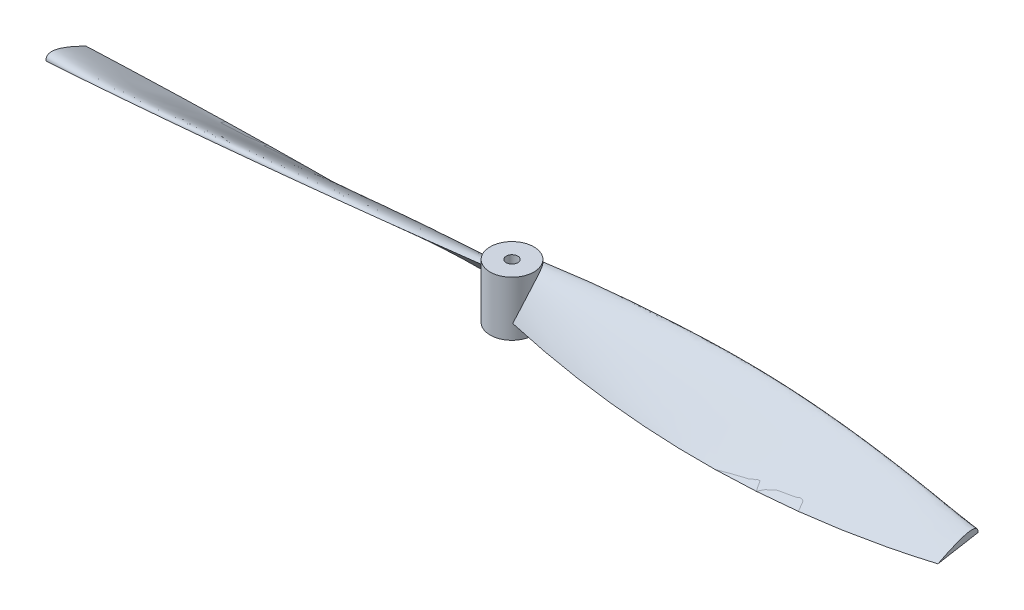
ISO-10303-21;
HEADER;
FILE_DESCRIPTION(('STEP AP214'),'2;1');
FILE_NAME('part.step','',(''),(''),'','','');
FILE_SCHEMA(('AUTOMOTIVE_DESIGN { 1 0 10303 214 1 1 1 1 }'));
ENDSEC;
DATA;
#1=APPLICATION_CONTEXT('core data for automotive mechanical design processes');
#2=APPLICATION_PROTOCOL_DEFINITION('international standard','automotive_design',2000,#1);
#3=PRODUCT_CONTEXT('',#1,'mechanical');
#4=PRODUCT('Part','Part','',(#3));
#5=PRODUCT_RELATED_PRODUCT_CATEGORY('part','',(#4));
#6=PRODUCT_DEFINITION_FORMATION('','',#4);
#7=PRODUCT_DEFINITION_CONTEXT('part definition',#1,'design');
#8=PRODUCT_DEFINITION('design','',#6,#7);
#9=PRODUCT_DEFINITION_SHAPE('','',#8);
#10=(LENGTH_UNIT() NAMED_UNIT(*) SI_UNIT(.MILLI.,.METRE.));
#11=(NAMED_UNIT(*) PLANE_ANGLE_UNIT() SI_UNIT($,.RADIAN.));
#12=(NAMED_UNIT(*) SI_UNIT($,.STERADIAN.) SOLID_ANGLE_UNIT());
#13=UNCERTAINTY_MEASURE_WITH_UNIT(LENGTH_MEASURE(1.E-05),#10,'distance_accuracy_value','');
#14=(GEOMETRIC_REPRESENTATION_CONTEXT(3) GLOBAL_UNCERTAINTY_ASSIGNED_CONTEXT((#13)) GLOBAL_UNIT_ASSIGNED_CONTEXT((#10,
#11,#12)) REPRESENTATION_CONTEXT('',''));
#15=CARTESIAN_POINT('',(0.,0.,0.));
#16=DIRECTION('',(0.,0.,1.));
#17=DIRECTION('',(1.,0.,0.));
#18=AXIS2_PLACEMENT_3D('',#15,#16,#17);
#19=CARTESIAN_POINT('',(0.,15.,0.));
#20=DIRECTION('',(0.,-1.,0.));
#21=DIRECTION('',(0.,0.,-1.));
#22=AXIS2_PLACEMENT_3D('',#19,#20,#21);
#23=CYLINDRICAL_SURFACE('',#22,6.);
#24=CARTESIAN_POINT('',(-3.95496399735066,14.1319443424082,4.51201283017459));
#25=CARTESIAN_POINT('',(-4.07301258590449,13.9919720922848,4.40851566135976));
#26=CARTESIAN_POINT('',(-4.18563428903774,13.8500035140051,4.3016278281284));
#27=CARTESIAN_POINT('',(-4.40009913790186,13.5628696315802,4.08199796443968));
#28=CARTESIAN_POINT('',(-4.50195563609008,13.417708563861,3.96926345095488));
#29=CARTESIAN_POINT('',(-4.69523078552242,13.124676312486,3.73863911310308));
#30=CARTESIAN_POINT('',(-4.78665264497937,12.9768059781311,3.62075088878637));
#31=CARTESIAN_POINT('',(-4.95881266970242,12.6795854354442,3.38109932242871));
#32=CARTESIAN_POINT('',(-5.03960495200348,12.5302472434192,3.25935986243932));
#33=CARTESIAN_POINT('',(-5.19124775832872,12.2296795403326,3.01197594581293));
#34=CARTESIAN_POINT('',(-5.26209527722762,12.0784494725521,2.88633032275507));
#35=CARTESIAN_POINT('',(-5.39393602853731,11.7745051656814,2.63173064198554));
#36=CARTESIAN_POINT('',(-5.45492816218919,11.6217907631148,2.50277621723621));
#37=CARTESIAN_POINT('',(-5.6823064639648,11.0006231380654,1.97459479571869));
#38=CARTESIAN_POINT('',(-5.80832968687274,10.5269049010096,1.56342091917948));
#39=CARTESIAN_POINT('',(-5.97108525735197,9.57442063696116,0.726859754562274));
#40=CARTESIAN_POINT('',(-6.00753848388859,9.09564348835387,0.301432212840051));
#41=CARTESIAN_POINT('',(-5.99351259472467,8.3371211120348,-0.37511009284523));
#42=CARTESIAN_POINT('',(-5.9725920477003,8.05640523298941,-0.626043476940594));
#43=CARTESIAN_POINT('',(-5.89884471414157,7.49704958452404,-1.12580960279973));
#44=CARTESIAN_POINT('',(-5.84600900913781,7.21841041746801,-1.37464173766871));
#45=CARTESIAN_POINT('',(-5.70797979713915,6.66573609371351,-1.86655299579988));
#46=CARTESIAN_POINT('',(-5.62289222708136,6.39168889867209,-2.10964821536638));
#47=CARTESIAN_POINT('',(-5.4194903260282,5.84919257114887,-2.58777528815577));
#48=CARTESIAN_POINT('',(-5.30119858375689,5.58073976572822,-2.82281250166595));
#49=CARTESIAN_POINT('',(-5.05194321798434,5.09399236770938,-3.2446655765344));
#50=CARTESIAN_POINT('',(-4.92606393610409,4.87456512655725,-3.43316458360225));
#51=CARTESIAN_POINT('',(-4.71842967964133,4.5507839047498,-3.70804752102877));
#52=CARTESIAN_POINT('',(-4.64605764554573,4.44371854823619,-3.79839035923032));
#53=CARTESIAN_POINT('',(-4.49488236250091,4.2316028575674,-3.97613314758453));
#54=CARTESIAN_POINT('',(-4.41607621271332,4.12655345896766,-4.06353174495334));
#55=CARTESIAN_POINT('',(-4.33400281681538,4.02266301107394,-4.14926735506841));
#56=B_SPLINE_CURVE_WITH_KNOTS('',3,(#24,#25,#26,#27,#28,#29,#30,#31,#32,#33,#34,#35,#36,#37,#38,
#39,#40,#41,#42,#43,#44,#45,#46,#47,#48,#49,#50,#51,#52,#53,#54,#55),.UNSPECIFIED.,.F.,.F.,(4,2,
2,2,2,2,2,2,2,2,2,2,2,2,2,4),(0.,0.630816559205775,1.26084127836206,1.89067176660723,
2.5171601660567,3.14383747314004,3.770584599198,5.68260193857561,7.60057005653625,
8.73068781320409,9.86112151962698,10.9878738496593,12.1138615026561,13.0590552259744,
13.5319380894295,14.0050353433539),.UNSPECIFIED.);
#57=CARTESIAN_POINT('',(-3.95496399735066,14.1319443424082,4.51201283017459));
#58=VERTEX_POINT('',#57);
#59=CARTESIAN_POINT('',(-4.33400281681538,4.02266301107394,-4.14926735506841));
#60=VERTEX_POINT('',#59);
#61=EDGE_CURVE('E72',#58,#60,#56,.T.);
#62=ORIENTED_EDGE('',*,*,#61,.T.);
#63=CARTESIAN_POINT('',(-4.33400281681537,4.0226630110739,-4.14926735506842));
#64=CARTESIAN_POINT('',(-4.41108668865342,4.26874073267822,-4.06871979126731));
#65=CARTESIAN_POINT('',(-4.48604335446543,4.51476782030348,-3.9859626385582));
#66=CARTESIAN_POINT('',(-4.6319452731176,5.00710640198958,-3.81546568438151));
#67=CARTESIAN_POINT('',(-4.70287884359336,5.25341679718309,-3.72771272044549));
#68=CARTESIAN_POINT('',(-4.84066459008062,5.74574710957774,-3.54695419321539));
#69=CARTESIAN_POINT('',(-4.90750984457173,5.99176587841737,-3.45394020882212));
#70=CARTESIAN_POINT('',(-5.03694526455831,6.48292857639192,-3.26229479269454));
#71=CARTESIAN_POINT('',(-5.09953268926733,6.72807184755887,-3.16365981637098));
#72=CARTESIAN_POINT('',(-5.22246670363477,7.22607886270326,-2.95649935282011));
#73=CARTESIAN_POINT('',(-5.28264212260617,7.47888873374958,-2.84774199304517));
#74=CARTESIAN_POINT('',(-5.39774534695752,7.98230680401593,-2.62302792544999));
#75=CARTESIAN_POINT('',(-5.45267647326811,8.2329163040701,-2.50707585146011));
#76=CARTESIAN_POINT('',(-5.55672309448359,8.73123159179376,-2.26713834191786));
#77=CARTESIAN_POINT('',(-5.60584338975269,8.97893962178,-2.14315967007601));
#78=CARTESIAN_POINT('',(-5.69748484997761,9.47070022240386,-1.88607979810628));
#79=CARTESIAN_POINT('',(-5.74000925224542,9.71475453283189,-1.75298311970252));
#80=CARTESIAN_POINT('',(-5.80327945540175,10.1104028425424,-1.52653258394716));
#81=CARTESIAN_POINT('',(-5.82632834723899,10.2634091240948,-1.43628473933333));
#82=CARTESIAN_POINT('',(-5.86887649932391,10.5671156133497,-1.2511273240876));
#83=CARTESIAN_POINT('',(-5.88837533088339,10.7178155405382,-1.15621719221515));
#84=CARTESIAN_POINT('',(-5.92332650115371,11.0164440326146,-0.961257679888069));
#85=CARTESIAN_POINT('',(-5.93877700866743,11.1643713153468,-0.861205998123435));
#86=CARTESIAN_POINT('',(-5.964875173711,11.4554723817944,-0.656379408553755));
#87=CARTESIAN_POINT('',(-5.97556283118164,11.598676025915,-0.551652290592832));
#88=CARTESIAN_POINT('',(-5.99154803090523,11.8807466788163,-0.336186441382137));
#89=CARTESIAN_POINT('',(-5.99684735588509,12.0196151071523,-0.225449711190232));
#90=CARTESIAN_POINT('',(-6.00108258088698,12.2918502788268,0.00256581819714362));
#91=CARTESIAN_POINT('',(-6.00002350858163,12.4252212850489,0.119839375952374));
#92=CARTESIAN_POINT('',(-5.99184928443638,12.6440156510454,0.323392098486134));
#93=CARTESIAN_POINT('',(-5.98675134514429,12.7312847879262,0.407769522599553));
#94=CARTESIAN_POINT('',(-5.9725225072129,12.9019510093369,0.580040643367135));
#95=CARTESIAN_POINT('',(-5.96339187659988,12.9853483507924,0.667934105980487));
#96=CARTESIAN_POINT('',(-5.94052560537882,13.1477068287313,0.847568657884288));
#97=CARTESIAN_POINT('',(-5.92677882809848,13.2266566923447,0.939318578215554));
#98=CARTESIAN_POINT('',(-5.89406794972715,13.3789664514997,1.12649396291793));
#99=CARTESIAN_POINT('',(-5.87510361169037,13.4523260929786,1.22191959404531));
#100=CARTESIAN_POINT('',(-5.83092289173632,13.5935140043611,1.4179565851827));
#101=CARTESIAN_POINT('',(-5.80560657998818,13.6612282888337,1.51862821975923));
#102=CARTESIAN_POINT('',(-5.74819761162671,13.7883428926302,1.72322444655154));
#103=CARTESIAN_POINT('',(-5.71610763568723,13.8477464854873,1.82714773810859));
#104=CARTESIAN_POINT('',(-5.64472240114243,13.9565313129221,2.03698752178088));
#105=CARTESIAN_POINT('',(-5.60546751730789,14.0059655945161,2.1428900009008));
#106=CARTESIAN_POINT('',(-5.51923979128609,14.0938677427188,2.35609736414504));
#107=CARTESIAN_POINT('',(-5.47226965545199,14.1323394418828,2.46340174440518));
#108=CARTESIAN_POINT('',(-5.37793384049103,14.1926537882022,2.66235464891089));
#109=CARTESIAN_POINT('',(-5.33161431512735,14.2160992691008,2.75401581515384));
#110=CARTESIAN_POINT('',(-5.23347444740558,14.2540822443566,2.93623017605696));
#111=CARTESIAN_POINT('',(-5.18165444368938,14.2686202867354,3.02678343854384));
#112=CARTESIAN_POINT('',(-5.0725206827319,14.2891039430543,3.2063452317342));
#113=CARTESIAN_POINT('',(-5.01517224389292,14.2949909693808,3.29533923285413));
#114=CARTESIAN_POINT('',(-4.8957678407628,14.2987433865475,3.4702550971592));
#115=CARTESIAN_POINT('',(-4.83371223255996,14.2966093835713,3.55617719200609));
#116=CARTESIAN_POINT('',(-4.72869322051909,14.2875642568122,3.69377916775132));
#117=CARTESIAN_POINT('',(-4.68697695956231,14.2826685713902,3.74656644520182));
#118=CARTESIAN_POINT('',(-4.60192932436234,14.2705332147019,3.85055274882306));
#119=CARTESIAN_POINT('',(-4.55859783723082,14.2632933793299,3.90175166352303));
#120=CARTESIAN_POINT('',(-4.47038247582018,14.2469299598115,4.0025202516602));
#121=CARTESIAN_POINT('',(-4.42549785621833,14.2378054605097,4.05208911997322));
#122=CARTESIAN_POINT('',(-4.33480178764063,14.2183354590592,4.14895659619051));
#123=CARTESIAN_POINT('',(-4.28900858737152,14.2080063970305,4.19627565903189));
#124=CARTESIAN_POINT('',(-4.19600122676346,14.1866346085878,4.28927726650552));
#125=CARTESIAN_POINT('',(-4.14878779011599,14.1755922424585,4.33496061947729));
#126=CARTESIAN_POINT('',(-4.05295447384784,14.1535527352288,4.42468685464986));
#127=CARTESIAN_POINT('',(-4.00433682755219,14.1425555510013,4.46873211168516));
#128=CARTESIAN_POINT('',(-3.95496399735066,14.1319443424082,4.51201283017459));
#129=B_SPLINE_CURVE_WITH_KNOTS('',3,(#63,#64,#65,#66,#67,#68,#69,#70,#71,#72,#73,#74,#75,#76,
#77,#78,#79,#80,#81,#82,#83,#84,#85,#86,#87,#88,#89,#90,#91,#92,#93,#94,#95,#96,#97,#98,#99,
#100,#101,#102,#103,#104,#105,#106,#107,#108,#109,#110,#111,#112,#113,#114,#115,#116,#117,#118,
#119,#120,#121,#122,#123,#124,#125,#126,#127,#128),.UNSPECIFIED.,.F.,.F.,(4,2,2,2,2,2,2,2,2,2,2,
2,2,2,2,2,2,2,2,2,2,2,2,2,2,2,2,2,2,2,2,2,4),(0.,0.810457974641976,1.62316011511679,
2.43720210353802,3.25176323144542,4.09676760323373,4.94123327940382,5.78499639206722,
6.62834406027042,7.16563599817206,7.70299277389417,8.24059219670847,8.77358743964957,
9.30640628396648,9.83880387657494,10.2031430076447,10.5674579271479,10.9326581649343,
11.2978749903477,11.6692435912183,12.0404654977953,12.4096567363571,12.7787187456391,
13.0942337853487,13.4097294113463,13.727351988257,14.0449505615467,14.2472534193782,
14.4495704427854,14.6519859392632,14.8519059372189,15.0517257348667,15.2512435537562),.UNSPECIFIED.);
#130=EDGE_CURVE('E12',#60,#58,#129,.T.);
#131=ORIENTED_EDGE('',*,*,#130,.T.);
#132=EDGE_LOOP('',(#62,#131));
#133=FACE_BOUND('',#132,.T.);
#134=CARTESIAN_POINT('',(3.95496399735066,14.1319443424082,-4.51201283017459));
#135=CARTESIAN_POINT('',(4.00119866207085,14.1418761661484,-4.47148350148986));
#136=CARTESIAN_POINT('',(4.04676949293845,14.1521523074791,-4.43028466918364));
#137=CARTESIAN_POINT('',(4.13661155901059,14.1727714372621,-4.34651853911986));
#138=CARTESIAN_POINT('',(4.18088292137542,14.1831144190519,-4.30395137612096));
#139=CARTESIAN_POINT('',(4.26860420712328,14.2033493668861,-4.2169739020823));
#140=CARTESIAN_POINT('',(4.31204130790099,14.2132357187568,-4.17254931182353));
#141=CARTESIAN_POINT('',(4.39763247550506,14.2319387936106,-4.08224218085359));
#142=CARTESIAN_POINT('',(4.4397862119144,14.2407552428506,-4.03635927079315));
#143=CARTESIAN_POINT('',(4.55560015297822,14.2632268135488,-3.9062759979549));
#144=CARTESIAN_POINT('',(4.62781459404936,14.275194959149,-3.82046737537932));
#145=CARTESIAN_POINT('',(4.76764641519559,14.2920571136843,-3.64447150067945));
#146=CARTESIAN_POINT('',(4.83526364729404,14.2969508950097,-3.55428410776972));
#147=CARTESIAN_POINT('',(4.96497447416731,14.2980190313878,-3.37069482613974));
#148=CARTESIAN_POINT('',(5.02709720890441,14.2942426587109,-3.27731405836729));
#149=CARTESIAN_POINT('',(5.14564130596027,14.2770098538055,-3.08785609725892));
#150=CARTESIAN_POINT('',(5.2020635542291,14.2635549284321,-2.99177932590147));
#151=CARTESIAN_POINT('',(5.30445865853128,14.2280256137596,-2.80589847440146));
#152=CARTESIAN_POINT('',(5.35090628198875,14.2067262765733,-2.71620694978279));
#153=CARTESIAN_POINT('',(5.43836092026612,14.1557083341582,-2.53657452656943));
#154=CARTESIAN_POINT('',(5.4793680503625,14.1259899073601,-2.44663363329976));
#155=CARTESIAN_POINT('',(5.55604445243874,14.0585084183418,-2.26714097011901));
#156=CARTESIAN_POINT('',(5.59169658182939,14.0207204207173,-2.17759130498496));
#157=CARTESIAN_POINT('',(5.6576784178956,13.9378735253437,-1.99991538168775));
#158=CARTESIAN_POINT('',(5.68800731050094,13.8928135175219,-1.91178934310424));
#159=CARTESIAN_POINT('',(5.75004997618697,13.7851159174677,-1.7174378661822));
#160=CARTESIAN_POINT('',(5.78047301680915,13.720820378209,-1.61172011025793));
#161=CARTESIAN_POINT('',(5.83443943174986,13.5839701398727,-1.40387416542246));
#162=CARTESIAN_POINT('',(5.85797720082957,13.511408778056,-1.3017489603418));
#163=CARTESIAN_POINT('',(5.89892795100441,13.3594296656734,-1.10141171965112));
#164=CARTESIAN_POINT('',(5.91633809830622,13.2800087639187,-1.00320151314785));
#165=CARTESIAN_POINT('',(5.94575519380071,13.1155595795372,-0.810838930639299));
#166=CARTESIAN_POINT('',(5.95776379699141,13.0305330236137,-0.716685319725059));
#167=CARTESIAN_POINT('',(5.97874259666434,12.8405842957939,-0.516229135785683));
#168=CARTESIAN_POINT('',(5.9868172364012,12.7347789993457,-0.410672681334593));
#169=CARTESIAN_POINT('',(5.99739566852743,12.5179543435598,-0.204665478838717));
#170=CARTESIAN_POINT('',(5.99989577625281,12.4069315850406,-0.104218150663553));
#171=CARTESIAN_POINT('',(6.00009786317036,12.1806777826948,0.091862839330213));
#172=CARTESIAN_POINT('',(5.99779849228568,12.0654455637199,0.1874951389482));
#173=CARTESIAN_POINT('',(5.98901074604875,11.8306365522089,0.375003581181962));
#174=CARTESIAN_POINT('',(5.98248929297612,11.7110325514432,0.466843919187223));
#175=CARTESIAN_POINT('',(5.9657736296792,11.469011736749,0.646265748632677));
#176=CARTESIAN_POINT('',(5.95558095748211,11.3465961208008,0.733849006128762));
#177=CARTESIAN_POINT('',(5.93196894501283,11.0994081860308,0.905101059696859));
#178=CARTESIAN_POINT('',(5.91855019734181,10.9746363039084,0.988770571320956));
#179=CARTESIAN_POINT('',(5.87784826378373,10.6298255472942,1.2132331983065));
#180=CARTESIAN_POINT('',(5.84766254920247,10.4077489447029,1.35037981597137));
#181=CARTESIAN_POINT('',(5.78011913115594,9.95895856317901,1.61520497883173));
#182=CARTESIAN_POINT('',(5.74275698831872,9.7322419919087,1.74287759523708));
#183=CARTESIAN_POINT('',(5.66188080256109,9.2750289323539,1.98998148085972));
#184=CARTESIAN_POINT('',(5.61835801850042,9.04452749187421,2.1094006749335));
#185=CARTESIAN_POINT('',(5.52591312283548,8.58052948491552,2.34090501628557));
#186=CARTESIAN_POINT('',(5.47698332656377,8.34702908347388,2.4529793550768));
#187=CARTESIAN_POINT('',(5.37428337141775,7.87774272146882,2.67049710701097));
#188=CARTESIAN_POINT('',(5.3205086468732,7.64195479590365,2.77593410306971));
#189=CARTESIAN_POINT('',(5.21147228839771,7.18116172874861,2.97536273217888));
#190=CARTESIAN_POINT('',(5.1564352967502,6.95623718118787,3.06966454440444));
#191=CARTESIAN_POINT('',(5.04266161293469,6.50548753510666,3.25318467365871));
#192=CARTESIAN_POINT('',(4.98392804636962,6.27966334468936,3.3424071670317));
#193=CARTESIAN_POINT('',(4.86297497713012,5.82769927044378,3.51605482653032));
#194=CARTESIAN_POINT('',(4.80076321762416,5.6015611012892,3.6004898672123));
#195=CARTESIAN_POINT('',(4.67301842303342,5.14954876154523,3.76479773551994));
#196=CARTESIAN_POINT('',(4.60749806024655,4.92367653865321,3.84468579774269));
#197=CARTESIAN_POINT('',(4.4732353970314,4.47277052232558,4.00007555395276));
#198=CARTESIAN_POINT('',(4.404511224597,4.24773832479611,4.07559753311766));
#199=CARTESIAN_POINT('',(4.33400281681537,4.0226630110739,4.14926735506842));
#200=B_SPLINE_CURVE_WITH_KNOTS('',3,(#134,#135,#136,#137,#138,#139,#140,#141,#142,#143,#144,
#145,#146,#147,#148,#149,#150,#151,#152,#153,#154,#155,#156,#157,#158,#159,#160,#161,#162,#163,
#164,#165,#166,#167,#168,#169,#170,#171,#172,#173,#174,#175,#176,#177,#178,#179,#180,#181,#182,
#183,#184,#185,#186,#187,#188,#189,#190,#191,#192,#193,#194,#195,#196,#197,#198,#199),
.UNSPECIFIED.,.F.,.F.,(4,2,2,2,2,2,2,2,2,2,2,2,2,2,2,2,2,2,2,2,2,2,2,2,2,2,2,2,2,2,2,2,4),(0.,
0.186832386850806,0.373646429738278,0.562348377681432,0.751098505178312,1.08911020703464,
1.42713278378886,1.76323914500326,2.09929318910327,2.40848214428971,2.71766454714664,
3.02781653395617,3.33801591033931,3.71968091464173,4.10165576981661,4.48380704251724,
4.86584114666002,5.31452380874846,5.76350295408722,6.21260841273852,6.66527565736122,
7.11775348090461,7.57014825174456,8.35799570943213,9.14633211204672,9.93579848636275,
10.7264016749857,11.5177578493112,12.267749751776,13.0171158106024,13.7648753611704,
14.5099609501117,15.2512481487481),.UNSPECIFIED.);
#201=CARTESIAN_POINT('',(3.95496399735066,14.1319443424082,-4.51201283017459));
#202=VERTEX_POINT('',#201);
#203=CARTESIAN_POINT('',(4.33400281681538,4.02266301107394,4.14926735506841));
#204=VERTEX_POINT('',#203);
#205=EDGE_CURVE('E86',#202,#204,#200,.T.);
#206=ORIENTED_EDGE('',*,*,#205,.F.);
#207=CARTESIAN_POINT('',(4.33400281681538,4.02266301107394,4.14926735506841));
#208=CARTESIAN_POINT('',(4.46618815203607,4.19002698614196,4.01114825737754));
#209=CARTESIAN_POINT('',(4.58992268478001,4.36036705230832,3.8687428713589));
#210=CARTESIAN_POINT('',(4.8208662031274,4.70583878910611,3.57686337538926));
#211=CARTESIAN_POINT('',(4.92808861104108,4.88096643020026,3.42739513721856));
#212=CARTESIAN_POINT('',(5.12622300254722,5.23445980047151,3.12323984429937));
#213=CARTESIAN_POINT('',(5.21719514678378,5.41281077582022,2.96857466842872));
#214=CARTESIAN_POINT('',(5.38373201485981,5.77264291612813,2.65462222658457));
#215=CARTESIAN_POINT('',(5.45929204204786,5.95412501704007,2.49533356850415));
#216=CARTESIAN_POINT('',(5.69228807666882,6.57994067997149,1.94362942629013));
#217=CARTESIAN_POINT('',(5.81307014022031,7.0305191253567,1.54228694537885));
#218=CARTESIAN_POINT('',(5.96977051002967,7.93994168750207,0.730303620174496));
#219=CARTESIAN_POINT('',(6.00543754535854,8.39880625842876,0.319638848780571));
#220=CARTESIAN_POINT('',(5.99569014627772,9.13227165536893,-0.333591584484566));
#221=CARTESIAN_POINT('',(5.97716736483079,9.40657699006194,-0.577179160471801));
#222=CARTESIAN_POINT('',(5.91046712990247,9.95458499931698,-1.0611572273053));
#223=CARTESIAN_POINT('',(5.86228394943976,10.2282875472448,-1.30154709156122));
#224=CARTESIAN_POINT('',(5.73633638917936,10.7730893233621,-1.77611541607573));
#225=CARTESIAN_POINT('',(5.65864202210914,11.0441931680119,-2.01030718491523));
#226=CARTESIAN_POINT('',(5.47337671734091,11.5830370624301,-2.47055866829869));
#227=CARTESIAN_POINT('',(5.36581466201944,11.8507780875653,-2.69662077798773));
#228=CARTESIAN_POINT('',(5.16259271429027,12.2898720080848,-3.06186803979435));
#229=CARTESIAN_POINT('',(5.07558278494719,12.462676605676,-3.20417005687663));
#230=CARTESIAN_POINT('',(4.8883149647486,12.8055081289077,-3.48318679339398));
#231=CARTESIAN_POINT('',(4.78806198124846,12.9755360573754,-3.61990355805283));
#232=CARTESIAN_POINT('',(4.57385762426114,13.3124812731428,-3.88705730959354));
#233=CARTESIAN_POINT('',(4.45988318649478,13.4793927625343,-4.01748319203434));
#234=CARTESIAN_POINT('',(4.21796805153895,13.8090515115888,-4.27075532933734));
#235=CARTESIAN_POINT('',(4.09001633973535,13.9717953605076,-4.39359548529906));
#236=CARTESIAN_POINT('',(3.95496399735066,14.1319443424082,-4.51201283017459));
#237=B_SPLINE_CURVE_WITH_KNOTS('',3,(#207,#208,#209,#210,#211,#212,#213,#214,#215,#216,#217,
#218,#219,#220,#221,#222,#223,#224,#225,#226,#227,#228,#229,#230,#231,#232,#233,#234,#235,#236),
.UNSPECIFIED.,.F.,.F.,(4,2,2,2,2,2,2,2,2,2,2,2,2,2,4),(0.,0.761912345224491,1.52320204331146,
2.28161213718473,3.04025300296389,4.87934941174568,6.72386839850998,7.82474773694386,
8.92583970548571,10.0243355816356,11.1225051244168,11.8426242918347,12.5624773560645,
13.2835577677298,14.0052105737999),.UNSPECIFIED.);
#238=EDGE_CURVE('E215',#204,#202,#237,.T.);
#239=ORIENTED_EDGE('',*,*,#238,.F.);
#240=EDGE_LOOP('',(#206,#239));
#241=FACE_BOUND('',#240,.T.);
#242=CARTESIAN_POINT('',(0.,15.,0.));
#243=DIRECTION('',(0.,1.,0.));
#244=DIRECTION('',(0.,0.,1.));
#245=AXIS2_PLACEMENT_3D('',#242,#243,#244);
#246=CIRCLE('',#245,6.);
#247=CARTESIAN_POINT('',(0.,15.,6.));
#248=VERTEX_POINT('',#247);
#249=EDGE_CURVE('E228',#248,#248,#246,.T.);
#250=ORIENTED_EDGE('',*,*,#249,.F.);
#251=EDGE_LOOP('',(#250));
#252=FACE_BOUND('',#251,.T.);
#253=CARTESIAN_POINT('',(0.,0.,0.));
#254=DIRECTION('',(0.,1.,0.));
#255=DIRECTION('',(0.,0.,1.));
#256=AXIS2_PLACEMENT_3D('',#253,#254,#255);
#257=CIRCLE('',#256,6.);
#258=CARTESIAN_POINT('',(0.,0.,6.));
#259=VERTEX_POINT('',#258);
#260=EDGE_CURVE('E229',#259,#259,#257,.T.);
#261=ORIENTED_EDGE('',*,*,#260,.T.);
#262=EDGE_LOOP('',(#261));
#263=FACE_BOUND('',#262,.T.);
#264=ADVANCED_FACE('F62',(#133,#241,#252,#263),#23,.T.);
#265=CARTESIAN_POINT('',(0.,15.,0.));
#266=DIRECTION('',(0.,1.,0.));
#267=DIRECTION('',(0.,0.,1.));
#268=AXIS2_PLACEMENT_3D('',#265,#266,#267);
#269=PLANE('',#268);
#270=CARTESIAN_POINT('',(0.,15.,0.));
#271=DIRECTION('',(0.,1.,0.));
#272=DIRECTION('',(0.,0.,1.));
#273=AXIS2_PLACEMENT_3D('',#270,#271,#272);
#274=CIRCLE('',#273,1.5875);
#275=CARTESIAN_POINT('',(0.,15.,1.5875));
#276=VERTEX_POINT('',#275);
#277=EDGE_CURVE('E329',#276,#276,#274,.T.);
#278=ORIENTED_EDGE('',*,*,#277,.F.);
#279=EDGE_LOOP('',(#278));
#280=FACE_BOUND('',#279,.T.);
#281=ORIENTED_EDGE('',*,*,#249,.T.);
#282=EDGE_LOOP('',(#281));
#283=FACE_BOUND('',#282,.T.);
#284=ADVANCED_FACE('F146',(#280,#283),#269,.T.);
#285=CARTESIAN_POINT('',(0.,0.,0.));
#286=DIRECTION('',(0.,1.,0.));
#287=DIRECTION('',(0.,0.,1.));
#288=AXIS2_PLACEMENT_3D('',#285,#286,#287);
#289=PLANE('',#288);
#290=CARTESIAN_POINT('',(0.,0.,0.));
#291=DIRECTION('',(0.,1.,0.));
#292=DIRECTION('',(0.,0.,1.));
#293=AXIS2_PLACEMENT_3D('',#290,#291,#292);
#294=CIRCLE('',#293,1.5875);
#295=CARTESIAN_POINT('',(0.,0.,1.5875));
#296=VERTEX_POINT('',#295);
#297=EDGE_CURVE('E67',#296,#296,#294,.T.);
#298=ORIENTED_EDGE('',*,*,#297,.T.);
#299=EDGE_LOOP('',(#298));
#300=FACE_BOUND('',#299,.T.);
#301=ORIENTED_EDGE('',*,*,#260,.F.);
#302=EDGE_LOOP('',(#301));
#303=FACE_BOUND('',#302,.T.);
#304=ADVANCED_FACE('F208',(#300,#303),#289,.F.);
#305=CARTESIAN_POINT('',(0.,14.0584355167066,-3.90091693224477));
#306=CARTESIAN_POINT('',(20.0163613845974,14.488211674464,-7.07602997354054));
#307=CARTESIAN_POINT('',(59.9933725801323,13.5934025627138,-10.9182818600998));
#308=CARTESIAN_POINT('',(100.016361384597,9.17942540515399,-9.74984596442364));
#309=CARTESIAN_POINT('',(120.,6.0952561127416,-7.91164091856942));
#310=CARTESIAN_POINT('',(0.,14.4872984936383,-2.64812471884785));
#311=CARTESIAN_POINT('',(20.011637464951,13.9857753783964,-3.7486819429666));
#312=CARTESIAN_POINT('',(59.9980964999185,21.7663283521157,-12.2435260702604));
#313=CARTESIAN_POINT('',(100.011637464951,9.94020444360194,-8.30165373242463));
#314=CARTESIAN_POINT('',(120.,8.63272193477932,-8.1401945865525));
#315=CARTESIAN_POINT('',(0.,15.8722613637868,-0.227005169572741));
#316=CARTESIAN_POINT('',(20.0069135453046,14.4394389755456,0.746993423485537));
#317=CARTESIAN_POINT('',(60.0028204197048,-4.98079442512257,11.5994111827611));
#318=CARTESIAN_POINT('',(100.006913545305,7.51916087378821,-2.96012861079376));
#319=CARTESIAN_POINT('',(120.,7.98836514855535,-4.47541536490372));
#320=CARTESIAN_POINT('',(0.,4.5168775627204,3.5131314779472));
#321=CARTESIAN_POINT('',(20.0021896256583,2.15275590147992,6.5616858881825));
#322=CARTESIAN_POINT('',(60.007544339491,-0.270490450584237,9.53848986965222));
#323=CARTESIAN_POINT('',(100.002189625658,1.9162946957128,6.27472940046898));
#324=CARTESIAN_POINT('',(120.,4.16218575406971,3.08269674637692));
#325=B_SPLINE_SURFACE_WITH_KNOTS('',3,3,((#305,#306,#307,#308,#309),(#310,#311,#312,#313,#314),
(#315,#316,#317,#318,#319),(#320,#321,#322,#323,#324)),.UNSPECIFIED.,.F.,.F.,.F.,(4,4),(4,1,4),
(0.,1.),(0.,0.499939162718313,1.),.UNSPECIFIED.);
#326=CARTESIAN_POINT('',(0.,14.0584355167066,-3.90091693224477));
#327=CARTESIAN_POINT('',(20.0163613845974,14.488211674464,-7.07602997354054));
#328=CARTESIAN_POINT('',(59.9933725801323,13.5934025627138,-10.9182818600998));
#329=CARTESIAN_POINT('',(100.016361384597,9.17942540515399,-9.74984596442364));
#330=CARTESIAN_POINT('',(120.,6.0952561127416,-7.91164091856942));
#331=B_SPLINE_CURVE_WITH_KNOTS('',3,(#326,#327,#328,#329,#330),.UNSPECIFIED.,.F.,.F.,(4,1,4),
(0.,0.499939162718313,1.),.UNSPECIFIED.);
#332=CARTESIAN_POINT('',(120.,6.0952561127416,-7.91164091856942));
#333=VERTEX_POINT('',#332);
#334=EDGE_CURVE('E230',#333,#202,#331,.F.);
#335=CARTESIAN_POINT('',(0.,4.5168775627204,3.5131314779472));
#336=CARTESIAN_POINT('',(20.0021896256583,2.15275590147992,6.5616858881825));
#337=CARTESIAN_POINT('',(60.007544339491,-0.270490450584237,9.53848986965222));
#338=CARTESIAN_POINT('',(100.002189625658,1.9162946957128,6.27472940046898));
#339=CARTESIAN_POINT('',(120.,4.16218575406971,3.08269674637692));
#340=B_SPLINE_CURVE_WITH_KNOTS('',3,(#335,#336,#337,#338,#339),.UNSPECIFIED.,.F.,.F.,(4,1,4),
(0.,0.499939162718313,1.),.UNSPECIFIED.);
#341=CARTESIAN_POINT('',(120.,4.16218575406971,3.08269674637692));
#342=VERTEX_POINT('',#341);
#343=EDGE_CURVE('E233',#204,#342,#340,.T.);
#344=CARTESIAN_POINT('',(120.,6.0952561127416,-7.91164091856942));
#345=CARTESIAN_POINT('',(120.,9.90145484579818,-8.25447142054404));
#346=CARTESIAN_POINT('',(120.,4.16218575406971,3.08269674637692));
#347=B_SPLINE_CURVE_WITH_KNOTS('',2,(#344,#345,#346),.UNSPECIFIED.,.F.,.F.,(3,3),(0.,1.),.UNSPECIFIED.);
#348=EDGE_CURVE('E234',#333,#342,#347,.T.);
#349=ORIENTED_EDGE('',*,*,#334,.T.);
#350=ORIENTED_EDGE('',*,*,#205,.T.);
#351=ORIENTED_EDGE('',*,*,#343,.T.);
#352=ORIENTED_EDGE('',*,*,#348,.F.);
#353=EDGE_LOOP('',(#349,#350,#351,#352));
#354=FACE_BOUND('',#353,.T.);
#355=ADVANCED_FACE('F209',(#354),#325,.T.);
#356=CARTESIAN_POINT('',(0.,4.51687756272044,3.51313147794718));
#357=CARTESIAN_POINT('',(20.0021896256583,2.15275590147994,6.56168588818249));
#358=CARTESIAN_POINT('',(60.007544339491,-0.270490450584244,9.53848986965222));
#359=CARTESIAN_POINT('',(100.002189625658,1.9162946957128,6.27472940046897));
#360=CARTESIAN_POINT('',(120.,4.16218575406972,3.08269674637689));
#361=CARTESIAN_POINT('',(0.,7.69739688071583,1.0417820078832));
#362=CARTESIAN_POINT('',(20.0069135453046,6.26457449247463,2.01578060094148));
#363=CARTESIAN_POINT('',(60.0028204197048,4.3508072205151,2.71956595973487));
#364=CARTESIAN_POINT('',(100.006913545305,4.33733826552653,0.933204278838096));
#365=CARTESIAN_POINT('',(120.,4.80654254029368,-0.58208247527188));
#366=CARTESIAN_POINT('',(0.,10.8779161987112,-1.42956746218079));
#367=CARTESIAN_POINT('',(20.011637464951,10.3763930834693,-2.53012468629953));
#368=CARTESIAN_POINT('',(59.9980964999185,8.97210489161444,-4.09935795018248));
#369=CARTESIAN_POINT('',(100.011637464951,6.75838183534026,-4.40832084279277));
#370=CARTESIAN_POINT('',(120.,5.45089932651764,-4.24686169692065));
#371=CARTESIAN_POINT('',(0.,14.0584355167066,-3.90091693224477));
#372=CARTESIAN_POINT('',(20.0163613845974,14.488211674464,-7.07602997354054));
#373=CARTESIAN_POINT('',(59.9933725801323,13.5934025627138,-10.9182818600998));
#374=CARTESIAN_POINT('',(100.016361384597,9.17942540515399,-9.74984596442365));
#375=CARTESIAN_POINT('',(120.,6.0952561127416,-7.91164091856942));
#376=B_SPLINE_SURFACE_WITH_KNOTS('',3,3,((#356,#357,#358,#359,#360),(#361,#362,#363,#364,#365),
(#366,#367,#368,#369,#370),(#371,#372,#373,#374,#375)),.UNSPECIFIED.,.F.,.F.,.F.,(4,4),(4,1,4),
(0.,1.),(0.,0.499939162718313,1.),.UNSPECIFIED.);
#377=CARTESIAN_POINT('',(120.,4.16218575406972,3.08269674637689));
#378=CARTESIAN_POINT('',(120.,6.0952561127416,-7.91164091856942));
#379=B_SPLINE_CURVE_WITH_KNOTS('',1,(#377,#378),.UNSPECIFIED.,.F.,.F.,(2,2),(0.,1.),.UNSPECIFIED.);
#380=EDGE_CURVE('E227',#342,#333,#379,.T.);
#381=ORIENTED_EDGE('',*,*,#343,.F.);
#382=ORIENTED_EDGE('',*,*,#238,.T.);
#383=ORIENTED_EDGE('',*,*,#334,.F.);
#384=ORIENTED_EDGE('',*,*,#380,.F.);
#385=EDGE_LOOP('',(#381,#382,#383,#384));
#386=FACE_BOUND('',#385,.T.);
#387=ADVANCED_FACE('F285',(#386),#376,.T.);
#388=CARTESIAN_POINT('',(120.,7.51508788960191,-5.33447175332015));
#389=DIRECTION('',(-1.,0.,0.));
#390=DIRECTION('',(0.,0.,1.));
#391=AXIS2_PLACEMENT_3D('',#388,#389,#390);
#392=PLANE('',#391);
#393=ORIENTED_EDGE('',*,*,#380,.T.);
#394=ORIENTED_EDGE('',*,*,#348,.T.);
#395=EDGE_LOOP('',(#393,#394));
#396=FACE_BOUND('',#395,.T.);
#397=ADVANCED_FACE('F64',(#396),#392,.F.);
#398=CARTESIAN_POINT('',(0.,14.0584355167066,3.90091693224477));
#399=CARTESIAN_POINT('',(-20.0163613845974,14.488211674464,7.07602997354054));
#400=CARTESIAN_POINT('',(-59.9933725801323,13.5934025627138,10.9182818600998));
#401=CARTESIAN_POINT('',(-100.016361384597,9.17942540515399,9.74984596442364));
#402=CARTESIAN_POINT('',(-120.,6.0952561127416,7.91164091856942));
#403=CARTESIAN_POINT('',(0.,14.4872984936383,2.64812471884785));
#404=CARTESIAN_POINT('',(-20.011637464951,13.9857753783964,3.7486819429666));
#405=CARTESIAN_POINT('',(-59.9980964999185,21.7663283521157,12.2435260702604));
#406=CARTESIAN_POINT('',(-100.011637464951,9.94020444360194,8.30165373242463));
#407=CARTESIAN_POINT('',(-120.,8.63272193477932,8.1401945865525));
#408=CARTESIAN_POINT('',(0.,15.8722613637868,0.227005169572741));
#409=CARTESIAN_POINT('',(-20.0069135453046,14.4394389755456,-0.746993423485537));
#410=CARTESIAN_POINT('',(-60.0028204197048,-4.98079442512257,-11.5994111827611));
#411=CARTESIAN_POINT('',(-100.006913545305,7.51916087378821,2.96012861079376));
#412=CARTESIAN_POINT('',(-120.,7.98836514855535,4.47541536490372));
#413=CARTESIAN_POINT('',(0.,4.5168775627204,-3.5131314779472));
#414=CARTESIAN_POINT('',(-20.0021896256583,2.15275590147992,-6.5616858881825));
#415=CARTESIAN_POINT('',(-60.007544339491,-0.270490450584237,-9.53848986965222));
#416=CARTESIAN_POINT('',(-100.002189625658,1.9162946957128,-6.27472940046898));
#417=CARTESIAN_POINT('',(-120.,4.16218575406971,-3.08269674637692));
#418=B_SPLINE_SURFACE_WITH_KNOTS('',3,3,((#398,#399,#400,#401,#402),(#403,#404,#405,#406,#407),
(#408,#409,#410,#411,#412),(#413,#414,#415,#416,#417)),.UNSPECIFIED.,.F.,.F.,.F.,(4,4),(4,1,4),
(0.,1.),(0.,0.499939162718313,1.),.UNSPECIFIED.);
#419=CARTESIAN_POINT('',(0.,4.5168775627204,-3.5131314779472));
#420=CARTESIAN_POINT('',(-20.0021896256583,2.15275590147992,-6.5616858881825));
#421=CARTESIAN_POINT('',(-60.007544339491,-0.270490450584237,-9.53848986965222));
#422=CARTESIAN_POINT('',(-100.002189625658,1.9162946957128,-6.27472940046898));
#423=CARTESIAN_POINT('',(-120.,4.16218575406971,-3.08269674637692));
#424=B_SPLINE_CURVE_WITH_KNOTS('',3,(#419,#420,#421,#422,#423),.UNSPECIFIED.,.F.,.F.,(4,1,4),
(0.,0.499939162718313,1.),.UNSPECIFIED.);
#425=CARTESIAN_POINT('',(-120.,4.16218575406971,-3.08269674637692));
#426=VERTEX_POINT('',#425);
#427=EDGE_CURVE('E79',#60,#426,#424,.T.);
#428=CARTESIAN_POINT('',(-120.,6.0952561127416,7.91164091856942));
#429=CARTESIAN_POINT('',(-120.,9.90145484579818,8.25447142054404));
#430=CARTESIAN_POINT('',(-120.,4.16218575406971,-3.08269674637692));
#431=B_SPLINE_CURVE_WITH_KNOTS('',2,(#428,#429,#430),.UNSPECIFIED.,.F.,.F.,(3,3),(0.,1.),.UNSPECIFIED.);
#432=CARTESIAN_POINT('',(-120.,6.0952561127416,7.91164091856942));
#433=VERTEX_POINT('',#432);
#434=EDGE_CURVE('E111',#433,#426,#431,.T.);
#435=CARTESIAN_POINT('',(0.,14.0584355167066,3.90091693224477));
#436=CARTESIAN_POINT('',(-20.0163613845974,14.488211674464,7.07602997354054));
#437=CARTESIAN_POINT('',(-59.9933725801323,13.5934025627138,10.9182818600998));
#438=CARTESIAN_POINT('',(-100.016361384597,9.17942540515399,9.74984596442364));
#439=CARTESIAN_POINT('',(-120.,6.0952561127416,7.91164091856942));
#440=B_SPLINE_CURVE_WITH_KNOTS('',3,(#435,#436,#437,#438,#439),.UNSPECIFIED.,.F.,.F.,(4,1,4),
(0.,0.499939162718313,1.),.UNSPECIFIED.);
#441=EDGE_CURVE('E103',#433,#58,#440,.F.);
#442=ORIENTED_EDGE('',*,*,#130,.F.);
#443=ORIENTED_EDGE('',*,*,#427,.T.);
#444=ORIENTED_EDGE('',*,*,#434,.F.);
#445=ORIENTED_EDGE('',*,*,#441,.T.);
#446=EDGE_LOOP('',(#442,#443,#444,#445));
#447=FACE_BOUND('',#446,.T.);
#448=ADVANCED_FACE('F115',(#447),#418,.T.);
#449=CARTESIAN_POINT('',(0.,4.51687756272044,-3.51313147794718));
#450=CARTESIAN_POINT('',(-20.0021896256583,2.15275590147994,-6.56168588818249));
#451=CARTESIAN_POINT('',(-60.007544339491,-0.270490450584244,-9.53848986965222));
#452=CARTESIAN_POINT('',(-100.002189625658,1.9162946957128,-6.27472940046897));
#453=CARTESIAN_POINT('',(-120.,4.16218575406972,-3.08269674637689));
#454=CARTESIAN_POINT('',(0.,7.69739688071583,-1.0417820078832));
#455=CARTESIAN_POINT('',(-20.0069135453046,6.26457449247463,-2.01578060094148));
#456=CARTESIAN_POINT('',(-60.0028204197048,4.3508072205151,-2.71956595973487));
#457=CARTESIAN_POINT('',(-100.006913545305,4.33733826552653,-0.933204278838096));
#458=CARTESIAN_POINT('',(-120.,4.80654254029368,0.58208247527188));
#459=CARTESIAN_POINT('',(0.,10.8779161987112,1.42956746218079));
#460=CARTESIAN_POINT('',(-20.011637464951,10.3763930834693,2.53012468629953));
#461=CARTESIAN_POINT('',(-59.9980964999185,8.97210489161444,4.09935795018248));
#462=CARTESIAN_POINT('',(-100.011637464951,6.75838183534026,4.40832084279277));
#463=CARTESIAN_POINT('',(-120.,5.45089932651764,4.24686169692065));
#464=CARTESIAN_POINT('',(0.,14.0584355167066,3.90091693224477));
#465=CARTESIAN_POINT('',(-20.0163613845974,14.488211674464,7.07602997354054));
#466=CARTESIAN_POINT('',(-59.9933725801323,13.5934025627138,10.9182818600998));
#467=CARTESIAN_POINT('',(-100.016361384597,9.17942540515399,9.74984596442365));
#468=CARTESIAN_POINT('',(-120.,6.0952561127416,7.91164091856942));
#469=B_SPLINE_SURFACE_WITH_KNOTS('',3,3,((#449,#450,#451,#452,#453),(#454,#455,#456,#457,#458),
(#459,#460,#461,#462,#463),(#464,#465,#466,#467,#468)),.UNSPECIFIED.,.F.,.F.,.F.,(4,4),(4,1,4),
(0.,1.),(0.,0.499939162718313,1.),.UNSPECIFIED.);
#470=CARTESIAN_POINT('',(-120.,4.16218575406972,-3.08269674637689));
#471=CARTESIAN_POINT('',(-120.,6.0952561127416,7.91164091856942));
#472=B_SPLINE_CURVE_WITH_KNOTS('',1,(#470,#471),.UNSPECIFIED.,.F.,.F.,(2,2),(0.,1.),.UNSPECIFIED.);
#473=EDGE_CURVE('E107',#426,#433,#472,.T.);
#474=ORIENTED_EDGE('',*,*,#61,.F.);
#475=ORIENTED_EDGE('',*,*,#441,.F.);
#476=ORIENTED_EDGE('',*,*,#473,.F.);
#477=ORIENTED_EDGE('',*,*,#427,.F.);
#478=EDGE_LOOP('',(#474,#475,#476,#477));
#479=FACE_BOUND('',#478,.T.);
#480=ADVANCED_FACE('F105',(#479),#469,.T.);
#481=CARTESIAN_POINT('',(-120.,7.51508788960191,5.33447175332015));
#482=DIRECTION('',(1.,0.,0.));
#483=DIRECTION('',(0.,0.,-1.));
#484=AXIS2_PLACEMENT_3D('',#481,#482,#483);
#485=PLANE('',#484);
#486=ORIENTED_EDGE('',*,*,#473,.T.);
#487=ORIENTED_EDGE('',*,*,#434,.T.);
#488=EDGE_LOOP('',(#486,#487));
#489=FACE_BOUND('',#488,.T.);
#490=ADVANCED_FACE('F122',(#489),#485,.F.);
#491=CARTESIAN_POINT('',(0.,-5.,0.));
#492=DIRECTION('',(0.,1.,0.));
#493=DIRECTION('',(0.,0.,1.));
#494=AXIS2_PLACEMENT_3D('',#491,#492,#493);
#495=CYLINDRICAL_SURFACE('',#494,1.5875);
#496=ORIENTED_EDGE('',*,*,#277,.T.);
#497=EDGE_LOOP('',(#496));
#498=FACE_BOUND('',#497,.T.);
#499=ORIENTED_EDGE('',*,*,#297,.F.);
#500=EDGE_LOOP('',(#499));
#501=FACE_BOUND('',#500,.T.);
#502=ADVANCED_FACE('F141',(#498,#501),#495,.F.);
#503=CLOSED_SHELL('',(#264,#284,#304,#355,#387,#397,#448,#480,#490,#502));
#504=MANIFOLD_SOLID_BREP('B2',#503);
#505=ADVANCED_BREP_SHAPE_REPRESENTATION('',(#18,#504),#14);
#506=SHAPE_DEFINITION_REPRESENTATION(#9,#505);
ENDSEC;
END-ISO-10303-21;
